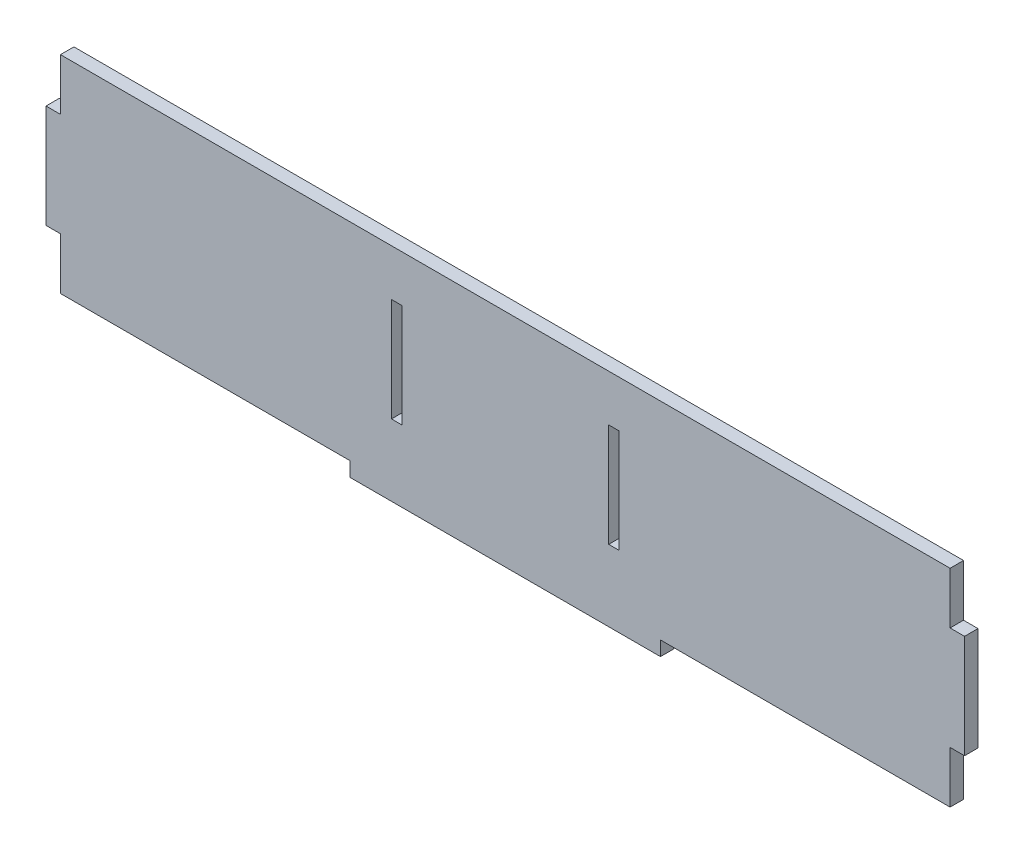
ISO-10303-21;
HEADER;
FILE_DESCRIPTION(('STEP AP214'),'2;1');
FILE_NAME('part.step','',(''),(''),'','','');
FILE_SCHEMA(('AUTOMOTIVE_DESIGN { 1 0 10303 214 1 1 1 1 }'));
ENDSEC;
DATA;
#1=APPLICATION_CONTEXT('core data for automotive mechanical design processes');
#2=APPLICATION_PROTOCOL_DEFINITION('international standard','automotive_design',2000,#1);
#3=PRODUCT_CONTEXT('',#1,'mechanical');
#4=PRODUCT('Part','Part','',(#3));
#5=PRODUCT_RELATED_PRODUCT_CATEGORY('part','',(#4));
#6=PRODUCT_DEFINITION_FORMATION('','',#4);
#7=PRODUCT_DEFINITION_CONTEXT('part definition',#1,'design');
#8=PRODUCT_DEFINITION('design','',#6,#7);
#9=PRODUCT_DEFINITION_SHAPE('','',#8);
#10=(LENGTH_UNIT() NAMED_UNIT(*) SI_UNIT(.MILLI.,.METRE.));
#11=(NAMED_UNIT(*) PLANE_ANGLE_UNIT() SI_UNIT($,.RADIAN.));
#12=(NAMED_UNIT(*) SI_UNIT($,.STERADIAN.) SOLID_ANGLE_UNIT());
#13=UNCERTAINTY_MEASURE_WITH_UNIT(LENGTH_MEASURE(1.E-05),#10,'distance_accuracy_value','');
#14=(GEOMETRIC_REPRESENTATION_CONTEXT(3) GLOBAL_UNCERTAINTY_ASSIGNED_CONTEXT((#13)) GLOBAL_UNIT_ASSIGNED_CONTEXT((#10,
#11,#12)) REPRESENTATION_CONTEXT('',''));
#15=CARTESIAN_POINT('',(0.,0.,0.));
#16=DIRECTION('',(0.,0.,1.));
#17=DIRECTION('',(1.,0.,0.));
#18=AXIS2_PLACEMENT_3D('',#15,#16,#17);
#19=CARTESIAN_POINT('',(43.,10.,1.3));
#20=DIRECTION('',(-1.,0.,0.));
#21=DIRECTION('',(0.,0.,1.));
#22=AXIS2_PLACEMENT_3D('',#19,#20,#21);
#23=PLANE('',#22);
#24=DIRECTION('',(0.,0.,1.));
#25=VECTOR('',#24,1.);
#26=CARTESIAN_POINT('',(43.,5.,0.));
#27=LINE('',#26,#25);
#28=CARTESIAN_POINT('',(43.,5.,0.));
#29=VERTEX_POINT('',#28);
#30=CARTESIAN_POINT('',(43.,5.,1.3));
#31=VERTEX_POINT('',#30);
#32=EDGE_CURVE('E251',#29,#31,#27,.T.);
#33=ORIENTED_EDGE('',*,*,#32,.F.);
#34=DIRECTION('',(0.,1.,0.));
#35=VECTOR('',#34,1.);
#36=CARTESIAN_POINT('',(43.,10.,0.));
#37=LINE('',#36,#35);
#38=CARTESIAN_POINT('',(43.,10.,0.));
#39=VERTEX_POINT('',#38);
#40=EDGE_CURVE('E398',#29,#39,#37,.T.);
#41=ORIENTED_EDGE('',*,*,#40,.T.);
#42=DIRECTION('',(0.,0.,-1.));
#43=VECTOR('',#42,1.);
#44=CARTESIAN_POINT('',(43.,10.,1.3));
#45=LINE('',#44,#43);
#46=CARTESIAN_POINT('',(43.,10.,1.3));
#47=VERTEX_POINT('',#46);
#48=EDGE_CURVE('E11',#47,#39,#45,.T.);
#49=ORIENTED_EDGE('',*,*,#48,.F.);
#50=DIRECTION('',(0.,1.,0.));
#51=VECTOR('',#50,1.);
#52=CARTESIAN_POINT('',(43.,10.,1.3));
#53=LINE('',#52,#51);
#54=EDGE_CURVE('E412',#31,#47,#53,.T.);
#55=ORIENTED_EDGE('',*,*,#54,.F.);
#56=EDGE_LOOP('',(#33,#41,#49,#55));
#57=FACE_BOUND('',#56,.T.);
#58=ADVANCED_FACE('F43',(#57),#23,.F.);
#59=CARTESIAN_POINT('',(-43.,10.,1.3));
#60=DIRECTION('',(1.,0.,0.));
#61=DIRECTION('',(0.,1.,0.));
#62=AXIS2_PLACEMENT_3D('',#59,#60,#61);
#63=PLANE('',#62);
#64=DIRECTION('',(0.,0.,1.));
#65=VECTOR('',#64,1.);
#66=CARTESIAN_POINT('',(-43.,-5.,0.));
#67=LINE('',#66,#65);
#68=CARTESIAN_POINT('',(-43.,-5.,0.));
#69=VERTEX_POINT('',#68);
#70=CARTESIAN_POINT('',(-43.,-5.,1.3));
#71=VERTEX_POINT('',#70);
#72=EDGE_CURVE('E325',#69,#71,#67,.T.);
#73=ORIENTED_EDGE('',*,*,#72,.F.);
#74=DIRECTION('',(0.,-1.,0.));
#75=VECTOR('',#74,1.);
#76=CARTESIAN_POINT('',(-43.,10.,0.));
#77=LINE('',#76,#75);
#78=CARTESIAN_POINT('',(-43.,-10.,0.));
#79=VERTEX_POINT('',#78);
#80=EDGE_CURVE('E433',#69,#79,#77,.T.);
#81=ORIENTED_EDGE('',*,*,#80,.T.);
#82=DIRECTION('',(0.,0.,-1.));
#83=VECTOR('',#82,1.);
#84=CARTESIAN_POINT('',(-43.,-10.,1.3));
#85=LINE('',#84,#83);
#86=CARTESIAN_POINT('',(-43.,-10.,1.3));
#87=VERTEX_POINT('',#86);
#88=EDGE_CURVE('E446',#87,#79,#85,.T.);
#89=ORIENTED_EDGE('',*,*,#88,.F.);
#90=DIRECTION('',(0.,-1.,0.));
#91=VECTOR('',#90,1.);
#92=CARTESIAN_POINT('',(-43.,10.,1.3));
#93=LINE('',#92,#91);
#94=EDGE_CURVE('E415',#71,#87,#93,.T.);
#95=ORIENTED_EDGE('',*,*,#94,.F.);
#96=EDGE_LOOP('',(#73,#81,#89,#95));
#97=FACE_BOUND('',#96,.T.);
#98=ADVANCED_FACE('F511',(#97),#63,.F.);
#99=CARTESIAN_POINT('',(-43.,-10.,1.3));
#100=DIRECTION('',(0.,1.,0.));
#101=DIRECTION('',(0.,0.,1.));
#102=AXIS2_PLACEMENT_3D('',#99,#100,#101);
#103=PLANE('',#102);
#104=DIRECTION('',(0.,0.,1.));
#105=VECTOR('',#104,1.);
#106=CARTESIAN_POINT('',(15.,-10.,0.));
#107=LINE('',#106,#105);
#108=CARTESIAN_POINT('',(15.,-10.,0.));
#109=VERTEX_POINT('',#108);
#110=CARTESIAN_POINT('',(15.,-10.,1.3));
#111=VERTEX_POINT('',#110);
#112=EDGE_CURVE('E399',#109,#111,#107,.T.);
#113=ORIENTED_EDGE('',*,*,#112,.F.);
#114=DIRECTION('',(1.,0.,0.));
#115=VECTOR('',#114,1.);
#116=CARTESIAN_POINT('',(-43.,-10.,0.));
#117=LINE('',#116,#115);
#118=CARTESIAN_POINT('',(43.,-10.,0.));
#119=VERTEX_POINT('',#118);
#120=EDGE_CURVE('E438',#109,#119,#117,.T.);
#121=ORIENTED_EDGE('',*,*,#120,.T.);
#122=DIRECTION('',(0.,0.,-1.));
#123=VECTOR('',#122,1.);
#124=CARTESIAN_POINT('',(43.,-10.,1.3));
#125=LINE('',#124,#123);
#126=CARTESIAN_POINT('',(43.,-10.,1.3));
#127=VERTEX_POINT('',#126);
#128=EDGE_CURVE('E425',#127,#119,#125,.T.);
#129=ORIENTED_EDGE('',*,*,#128,.F.);
#130=DIRECTION('',(1.,0.,0.));
#131=VECTOR('',#130,1.);
#132=CARTESIAN_POINT('',(-43.,-10.,1.3));
#133=LINE('',#132,#131);
#134=EDGE_CURVE('E420',#111,#127,#133,.T.);
#135=ORIENTED_EDGE('',*,*,#134,.F.);
#136=EDGE_LOOP('',(#113,#121,#129,#135));
#137=FACE_BOUND('',#136,.T.);
#138=ADVANCED_FACE('F488',(#137),#103,.F.);
#139=CARTESIAN_POINT('',(43.,-5.,0.));
#140=VERTEX_POINT('',#139);
#141=EDGE_CURVE('E426',#119,#140,#37,.T.);
#142=ORIENTED_EDGE('',*,*,#141,.T.);
#143=DIRECTION('',(0.,0.,1.));
#144=VECTOR('',#143,1.);
#145=CARTESIAN_POINT('',(43.,-5.,0.));
#146=LINE('',#145,#144);
#147=CARTESIAN_POINT('',(43.,-5.,1.3));
#148=VERTEX_POINT('',#147);
#149=EDGE_CURVE('E299',#140,#148,#146,.T.);
#150=ORIENTED_EDGE('',*,*,#149,.T.);
#151=EDGE_CURVE('E407',#127,#148,#53,.T.);
#152=ORIENTED_EDGE('',*,*,#151,.F.);
#153=ORIENTED_EDGE('',*,*,#128,.T.);
#154=EDGE_LOOP('',(#142,#150,#152,#153));
#155=FACE_BOUND('',#154,.T.);
#156=ADVANCED_FACE('F45',(#155),#23,.F.);
#157=CARTESIAN_POINT('',(-43.,10.,1.3));
#158=DIRECTION('',(0.,-1.,0.));
#159=DIRECTION('',(0.,0.,-1.));
#160=AXIS2_PLACEMENT_3D('',#157,#158,#159);
#161=PLANE('',#160);
#162=DIRECTION('',(-1.,0.,0.));
#163=VECTOR('',#162,1.);
#164=CARTESIAN_POINT('',(-43.,10.,0.));
#165=LINE('',#164,#163);
#166=CARTESIAN_POINT('',(-43.,10.,0.));
#167=VERTEX_POINT('',#166);
#168=EDGE_CURVE('E430',#39,#167,#165,.T.);
#169=ORIENTED_EDGE('',*,*,#168,.T.);
#170=DIRECTION('',(0.,0.,-1.));
#171=VECTOR('',#170,1.);
#172=CARTESIAN_POINT('',(-43.,10.,1.3));
#173=LINE('',#172,#171);
#174=CARTESIAN_POINT('',(-43.,10.,1.3));
#175=VERTEX_POINT('',#174);
#176=EDGE_CURVE('E52',#175,#167,#173,.T.);
#177=ORIENTED_EDGE('',*,*,#176,.F.);
#178=DIRECTION('',(-1.,0.,0.));
#179=VECTOR('',#178,1.);
#180=CARTESIAN_POINT('',(-43.,10.,1.3));
#181=LINE('',#180,#179);
#182=EDGE_CURVE('E411',#47,#175,#181,.T.);
#183=ORIENTED_EDGE('',*,*,#182,.F.);
#184=ORIENTED_EDGE('',*,*,#48,.T.);
#185=EDGE_LOOP('',(#169,#177,#183,#184));
#186=FACE_BOUND('',#185,.T.);
#187=ADVANCED_FACE('F472',(#186),#161,.F.);
#188=CARTESIAN_POINT('',(-43.,5.,0.));
#189=VERTEX_POINT('',#188);
#190=EDGE_CURVE('E434',#167,#189,#77,.T.);
#191=ORIENTED_EDGE('',*,*,#190,.T.);
#192=DIRECTION('',(0.,0.,1.));
#193=VECTOR('',#192,1.);
#194=CARTESIAN_POINT('',(-43.,5.,0.));
#195=LINE('',#194,#193);
#196=CARTESIAN_POINT('',(-43.,5.,1.3));
#197=VERTEX_POINT('',#196);
#198=EDGE_CURVE('E335',#189,#197,#195,.T.);
#199=ORIENTED_EDGE('',*,*,#198,.T.);
#200=EDGE_CURVE('E416',#175,#197,#93,.T.);
#201=ORIENTED_EDGE('',*,*,#200,.F.);
#202=ORIENTED_EDGE('',*,*,#176,.T.);
#203=EDGE_LOOP('',(#191,#199,#201,#202));
#204=FACE_BOUND('',#203,.T.);
#205=ADVANCED_FACE('F455',(#204),#63,.F.);
#206=CARTESIAN_POINT('',(-15.,-10.,0.));
#207=VERTEX_POINT('',#206);
#208=EDGE_CURVE('E439',#79,#207,#117,.T.);
#209=ORIENTED_EDGE('',*,*,#208,.T.);
#210=DIRECTION('',(0.,0.,1.));
#211=VECTOR('',#210,1.);
#212=CARTESIAN_POINT('',(-15.,-10.,0.));
#213=LINE('',#212,#211);
#214=CARTESIAN_POINT('',(-15.,-10.,1.3));
#215=VERTEX_POINT('',#214);
#216=EDGE_CURVE('E394',#207,#215,#213,.T.);
#217=ORIENTED_EDGE('',*,*,#216,.T.);
#218=EDGE_CURVE('E421',#87,#215,#133,.T.);
#219=ORIENTED_EDGE('',*,*,#218,.F.);
#220=ORIENTED_EDGE('',*,*,#88,.T.);
#221=EDGE_LOOP('',(#209,#217,#219,#220));
#222=FACE_BOUND('',#221,.T.);
#223=ADVANCED_FACE('F523',(#222),#103,.F.);
#224=CARTESIAN_POINT('',(0.,0.,1.3));
#225=DIRECTION('',(0.,0.,1.));
#226=DIRECTION('',(1.,0.,0.));
#227=AXIS2_PLACEMENT_3D('',#224,#225,#226);
#228=PLANE('',#227);
#229=DIRECTION('',(0.,-1.,0.));
#230=VECTOR('',#229,1.);
#231=CARTESIAN_POINT('',(-11.,5.5,1.3));
#232=LINE('',#231,#230);
#233=CARTESIAN_POINT('',(-11.,5.5,1.3));
#234=VERTEX_POINT('',#233);
#235=CARTESIAN_POINT('',(-11.,-4.5,1.3));
#236=VERTEX_POINT('',#235);
#237=EDGE_CURVE('E59',#234,#236,#232,.T.);
#238=ORIENTED_EDGE('',*,*,#237,.F.);
#239=DIRECTION('',(-1.,0.,0.));
#240=VECTOR('',#239,1.);
#241=CARTESIAN_POINT('',(-11.,5.5,1.3));
#242=LINE('',#241,#240);
#243=CARTESIAN_POINT('',(-10.,5.5,1.3));
#244=VERTEX_POINT('',#243);
#245=EDGE_CURVE('E229',#244,#234,#242,.T.);
#246=ORIENTED_EDGE('',*,*,#245,.F.);
#247=DIRECTION('',(0.,1.,0.));
#248=VECTOR('',#247,1.);
#249=CARTESIAN_POINT('',(-10.,5.5,1.3));
#250=LINE('',#249,#248);
#251=CARTESIAN_POINT('',(-10.,-4.5,1.3));
#252=VERTEX_POINT('',#251);
#253=EDGE_CURVE('E233',#252,#244,#250,.T.);
#254=ORIENTED_EDGE('',*,*,#253,.F.);
#255=DIRECTION('',(1.,0.,0.));
#256=VECTOR('',#255,1.);
#257=CARTESIAN_POINT('',(-11.,-4.5,1.3));
#258=LINE('',#257,#256);
#259=EDGE_CURVE('E242',#236,#252,#258,.T.);
#260=ORIENTED_EDGE('',*,*,#259,.F.);
#261=EDGE_LOOP('',(#238,#246,#254,#260));
#262=FACE_BOUND('',#261,.T.);
#263=DIRECTION('',(0.,-1.,0.));
#264=VECTOR('',#263,1.);
#265=CARTESIAN_POINT('',(10.,5.5,1.3));
#266=LINE('',#265,#264);
#267=CARTESIAN_POINT('',(10.,5.5,1.3));
#268=VERTEX_POINT('',#267);
#269=CARTESIAN_POINT('',(10.,-4.5,1.3));
#270=VERTEX_POINT('',#269);
#271=EDGE_CURVE('E67',#268,#270,#266,.T.);
#272=ORIENTED_EDGE('',*,*,#271,.F.);
#273=DIRECTION('',(-1.,0.,0.));
#274=VECTOR('',#273,1.);
#275=CARTESIAN_POINT('',(10.,5.5,1.3));
#276=LINE('',#275,#274);
#277=CARTESIAN_POINT('',(11.,5.5,1.3));
#278=VERTEX_POINT('',#277);
#279=EDGE_CURVE('E270',#278,#268,#276,.T.);
#280=ORIENTED_EDGE('',*,*,#279,.F.);
#281=DIRECTION('',(0.,1.,0.));
#282=VECTOR('',#281,1.);
#283=CARTESIAN_POINT('',(11.,5.5,1.3));
#284=LINE('',#283,#282);
#285=CARTESIAN_POINT('',(11.,-4.5,1.3));
#286=VERTEX_POINT('',#285);
#287=EDGE_CURVE('E274',#286,#278,#284,.T.);
#288=ORIENTED_EDGE('',*,*,#287,.F.);
#289=DIRECTION('',(1.,0.,0.));
#290=VECTOR('',#289,1.);
#291=CARTESIAN_POINT('',(10.,-4.5,1.3));
#292=LINE('',#291,#290);
#293=EDGE_CURVE('E279',#270,#286,#292,.T.);
#294=ORIENTED_EDGE('',*,*,#293,.F.);
#295=EDGE_LOOP('',(#272,#280,#288,#294));
#296=FACE_BOUND('',#295,.T.);
#297=ORIENTED_EDGE('',*,*,#151,.T.);
#298=DIRECTION('',(1.,0.,0.));
#299=VECTOR('',#298,1.);
#300=CARTESIAN_POINT('',(43.,-5.,1.3));
#301=LINE('',#300,#299);
#302=CARTESIAN_POINT('',(44.4,-5.,1.3));
#303=VERTEX_POINT('',#302);
#304=EDGE_CURVE('E321',#148,#303,#301,.T.);
#305=ORIENTED_EDGE('',*,*,#304,.T.);
#306=DIRECTION('',(0.,1.,0.));
#307=VECTOR('',#306,1.);
#308=CARTESIAN_POINT('',(44.4,5.,1.3));
#309=LINE('',#308,#307);
#310=CARTESIAN_POINT('',(44.4,5.,1.3));
#311=VERTEX_POINT('',#310);
#312=EDGE_CURVE('E316',#303,#311,#309,.T.);
#313=ORIENTED_EDGE('',*,*,#312,.T.);
#314=DIRECTION('',(-1.,0.,0.));
#315=VECTOR('',#314,1.);
#316=CARTESIAN_POINT('',(43.,5.,1.3));
#317=LINE('',#316,#315);
#318=EDGE_CURVE('E312',#311,#31,#317,.T.);
#319=ORIENTED_EDGE('',*,*,#318,.T.);
#320=ORIENTED_EDGE('',*,*,#54,.T.);
#321=ORIENTED_EDGE('',*,*,#182,.T.);
#322=ORIENTED_EDGE('',*,*,#200,.T.);
#323=DIRECTION('',(-1.,0.,0.));
#324=VECTOR('',#323,1.);
#325=CARTESIAN_POINT('',(-43.,5.,1.3));
#326=LINE('',#325,#324);
#327=CARTESIAN_POINT('',(-44.4,5.,1.3));
#328=VERTEX_POINT('',#327);
#329=EDGE_CURVE('E357',#197,#328,#326,.T.);
#330=ORIENTED_EDGE('',*,*,#329,.T.);
#331=DIRECTION('',(0.,-1.,0.));
#332=VECTOR('',#331,1.);
#333=CARTESIAN_POINT('',(-44.4,5.,1.3));
#334=LINE('',#333,#332);
#335=CARTESIAN_POINT('',(-44.4,-5.,1.3));
#336=VERTEX_POINT('',#335);
#337=EDGE_CURVE('E352',#328,#336,#334,.T.);
#338=ORIENTED_EDGE('',*,*,#337,.T.);
#339=DIRECTION('',(1.,0.,0.));
#340=VECTOR('',#339,1.);
#341=CARTESIAN_POINT('',(-43.,-5.,1.3));
#342=LINE('',#341,#340);
#343=EDGE_CURVE('E348',#336,#71,#342,.T.);
#344=ORIENTED_EDGE('',*,*,#343,.T.);
#345=ORIENTED_EDGE('',*,*,#94,.T.);
#346=ORIENTED_EDGE('',*,*,#218,.T.);
#347=DIRECTION('',(0.,-1.,0.));
#348=VECTOR('',#347,1.);
#349=CARTESIAN_POINT('',(-15.,-10.,1.3));
#350=LINE('',#349,#348);
#351=CARTESIAN_POINT('',(-15.,-11.4,1.3));
#352=VERTEX_POINT('',#351);
#353=EDGE_CURVE('E361',#215,#352,#350,.T.);
#354=ORIENTED_EDGE('',*,*,#353,.T.);
#355=DIRECTION('',(1.,0.,0.));
#356=VECTOR('',#355,1.);
#357=CARTESIAN_POINT('',(-15.,-11.4,1.3));
#358=LINE('',#357,#356);
#359=CARTESIAN_POINT('',(15.,-11.4,1.3));
#360=VERTEX_POINT('',#359);
#361=EDGE_CURVE('E387',#352,#360,#358,.T.);
#362=ORIENTED_EDGE('',*,*,#361,.T.);
#363=DIRECTION('',(0.,1.,0.));
#364=VECTOR('',#363,1.);
#365=CARTESIAN_POINT('',(15.,-10.,1.3));
#366=LINE('',#365,#364);
#367=EDGE_CURVE('E376',#360,#111,#366,.T.);
#368=ORIENTED_EDGE('',*,*,#367,.T.);
#369=ORIENTED_EDGE('',*,*,#134,.T.);
#370=EDGE_LOOP('',(#297,#305,#313,#319,#320,#321,#322,#330,#338,#344,#345,#346,#354,#362,#368,#369));
#371=FACE_BOUND('',#370,.T.);
#372=ADVANCED_FACE('F469',(#262,#296,#371),#228,.T.);
#373=CARTESIAN_POINT('',(0.,0.,0.));
#374=DIRECTION('',(0.,0.,1.));
#375=DIRECTION('',(1.,0.,0.));
#376=AXIS2_PLACEMENT_3D('',#373,#374,#375);
#377=PLANE('',#376);
#378=DIRECTION('',(-1.,0.,0.));
#379=VECTOR('',#378,1.);
#380=CARTESIAN_POINT('',(-11.,5.5,0.));
#381=LINE('',#380,#379);
#382=CARTESIAN_POINT('',(-10.,5.5,0.));
#383=VERTEX_POINT('',#382);
#384=CARTESIAN_POINT('',(-11.,5.5,0.));
#385=VERTEX_POINT('',#384);
#386=EDGE_CURVE('E214',#383,#385,#381,.T.);
#387=ORIENTED_EDGE('',*,*,#386,.T.);
#388=DIRECTION('',(0.,-1.,0.));
#389=VECTOR('',#388,1.);
#390=CARTESIAN_POINT('',(-11.,5.5,0.));
#391=LINE('',#390,#389);
#392=CARTESIAN_POINT('',(-11.,-4.5,0.));
#393=VERTEX_POINT('',#392);
#394=EDGE_CURVE('E207',#385,#393,#391,.T.);
#395=ORIENTED_EDGE('',*,*,#394,.T.);
#396=DIRECTION('',(1.,0.,0.));
#397=VECTOR('',#396,1.);
#398=CARTESIAN_POINT('',(-11.,-4.5,0.));
#399=LINE('',#398,#397);
#400=CARTESIAN_POINT('',(-10.,-4.5,0.));
#401=VERTEX_POINT('',#400);
#402=EDGE_CURVE('E218',#393,#401,#399,.T.);
#403=ORIENTED_EDGE('',*,*,#402,.T.);
#404=DIRECTION('',(0.,1.,0.));
#405=VECTOR('',#404,1.);
#406=CARTESIAN_POINT('',(-10.,5.5,0.));
#407=LINE('',#406,#405);
#408=EDGE_CURVE('E223',#401,#383,#407,.T.);
#409=ORIENTED_EDGE('',*,*,#408,.T.);
#410=EDGE_LOOP('',(#387,#395,#403,#409));
#411=FACE_BOUND('',#410,.T.);
#412=DIRECTION('',(-1.,0.,0.));
#413=VECTOR('',#412,1.);
#414=CARTESIAN_POINT('',(10.,5.5,0.));
#415=LINE('',#414,#413);
#416=CARTESIAN_POINT('',(11.,5.5,0.));
#417=VERTEX_POINT('',#416);
#418=CARTESIAN_POINT('',(10.,5.5,0.));
#419=VERTEX_POINT('',#418);
#420=EDGE_CURVE('E260',#417,#419,#415,.T.);
#421=ORIENTED_EDGE('',*,*,#420,.T.);
#422=DIRECTION('',(0.,-1.,0.));
#423=VECTOR('',#422,1.);
#424=CARTESIAN_POINT('',(10.,5.5,0.));
#425=LINE('',#424,#423);
#426=CARTESIAN_POINT('',(10.,-4.5,0.));
#427=VERTEX_POINT('',#426);
#428=EDGE_CURVE('E275',#419,#427,#425,.T.);
#429=ORIENTED_EDGE('',*,*,#428,.T.);
#430=DIRECTION('',(1.,0.,0.));
#431=VECTOR('',#430,1.);
#432=CARTESIAN_POINT('',(10.,-4.5,0.));
#433=LINE('',#432,#431);
#434=CARTESIAN_POINT('',(11.,-4.5,0.));
#435=VERTEX_POINT('',#434);
#436=EDGE_CURVE('E292',#427,#435,#433,.T.);
#437=ORIENTED_EDGE('',*,*,#436,.T.);
#438=DIRECTION('',(0.,1.,0.));
#439=VECTOR('',#438,1.);
#440=CARTESIAN_POINT('',(11.,5.5,0.));
#441=LINE('',#440,#439);
#442=EDGE_CURVE('E288',#435,#417,#441,.T.);
#443=ORIENTED_EDGE('',*,*,#442,.T.);
#444=EDGE_LOOP('',(#421,#429,#437,#443));
#445=FACE_BOUND('',#444,.T.);
#446=ORIENTED_EDGE('',*,*,#141,.F.);
#447=ORIENTED_EDGE('',*,*,#120,.F.);
#448=DIRECTION('',(0.,1.,0.));
#449=VECTOR('',#448,1.);
#450=CARTESIAN_POINT('',(15.,-10.,0.));
#451=LINE('',#450,#449);
#452=CARTESIAN_POINT('',(15.,-11.4,0.));
#453=VERTEX_POINT('',#452);
#454=EDGE_CURVE('E380',#453,#109,#451,.T.);
#455=ORIENTED_EDGE('',*,*,#454,.F.);
#456=DIRECTION('',(1.,0.,0.));
#457=VECTOR('',#456,1.);
#458=CARTESIAN_POINT('',(-15.,-11.4,0.));
#459=LINE('',#458,#457);
#460=CARTESIAN_POINT('',(-15.,-11.4,0.));
#461=VERTEX_POINT('',#460);
#462=EDGE_CURVE('E375',#461,#453,#459,.T.);
#463=ORIENTED_EDGE('',*,*,#462,.F.);
#464=DIRECTION('',(0.,-1.,0.));
#465=VECTOR('',#464,1.);
#466=CARTESIAN_POINT('',(-15.,-10.,0.));
#467=LINE('',#466,#465);
#468=EDGE_CURVE('E371',#207,#461,#467,.T.);
#469=ORIENTED_EDGE('',*,*,#468,.F.);
#470=ORIENTED_EDGE('',*,*,#208,.F.);
#471=ORIENTED_EDGE('',*,*,#80,.F.);
#472=DIRECTION('',(1.,0.,0.));
#473=VECTOR('',#472,1.);
#474=CARTESIAN_POINT('',(-43.,-5.,0.));
#475=LINE('',#474,#473);
#476=CARTESIAN_POINT('',(-44.4,-5.,0.));
#477=VERTEX_POINT('',#476);
#478=EDGE_CURVE('E339',#477,#69,#475,.T.);
#479=ORIENTED_EDGE('',*,*,#478,.F.);
#480=DIRECTION('',(0.,-1.,0.));
#481=VECTOR('',#480,1.);
#482=CARTESIAN_POINT('',(-44.4,5.,0.));
#483=LINE('',#482,#481);
#484=CARTESIAN_POINT('',(-44.4,5.,0.));
#485=VERTEX_POINT('',#484);
#486=EDGE_CURVE('E364',#485,#477,#483,.T.);
#487=ORIENTED_EDGE('',*,*,#486,.F.);
#488=DIRECTION('',(-1.,0.,0.));
#489=VECTOR('',#488,1.);
#490=CARTESIAN_POINT('',(-43.,5.,0.));
#491=LINE('',#490,#489);
#492=EDGE_CURVE('E353',#189,#485,#491,.T.);
#493=ORIENTED_EDGE('',*,*,#492,.F.);
#494=ORIENTED_EDGE('',*,*,#190,.F.);
#495=ORIENTED_EDGE('',*,*,#168,.F.);
#496=ORIENTED_EDGE('',*,*,#40,.F.);
#497=DIRECTION('',(-1.,0.,0.));
#498=VECTOR('',#497,1.);
#499=CARTESIAN_POINT('',(43.,5.,0.));
#500=LINE('',#499,#498);
#501=CARTESIAN_POINT('',(44.4,5.,0.));
#502=VERTEX_POINT('',#501);
#503=EDGE_CURVE('E303',#502,#29,#500,.T.);
#504=ORIENTED_EDGE('',*,*,#503,.F.);
#505=DIRECTION('',(0.,1.,0.));
#506=VECTOR('',#505,1.);
#507=CARTESIAN_POINT('',(44.4,5.,0.));
#508=LINE('',#507,#506);
#509=CARTESIAN_POINT('',(44.4,-5.,0.));
#510=VERTEX_POINT('',#509);
#511=EDGE_CURVE('E328',#510,#502,#508,.T.);
#512=ORIENTED_EDGE('',*,*,#511,.F.);
#513=DIRECTION('',(1.,0.,0.));
#514=VECTOR('',#513,1.);
#515=CARTESIAN_POINT('',(43.,-5.,0.));
#516=LINE('',#515,#514);
#517=EDGE_CURVE('E317',#140,#510,#516,.T.);
#518=ORIENTED_EDGE('',*,*,#517,.F.);
#519=EDGE_LOOP('',(#446,#447,#455,#463,#469,#470,#471,#479,#487,#493,#494,#495,#496,#504,#512,#518));
#520=FACE_BOUND('',#519,.T.);
#521=ADVANCED_FACE('F225',(#411,#445,#520),#377,.F.);
#522=CARTESIAN_POINT('',(-15.,-10.,0.));
#523=DIRECTION('',(-1.,0.,0.));
#524=DIRECTION('',(0.,-1.,0.));
#525=AXIS2_PLACEMENT_3D('',#522,#523,#524);
#526=PLANE('',#525);
#527=ORIENTED_EDGE('',*,*,#353,.F.);
#528=ORIENTED_EDGE('',*,*,#216,.F.);
#529=ORIENTED_EDGE('',*,*,#468,.T.);
#530=DIRECTION('',(0.,0.,1.));
#531=VECTOR('',#530,1.);
#532=CARTESIAN_POINT('',(-15.,-11.4,0.));
#533=LINE('',#532,#531);
#534=EDGE_CURVE('E383',#461,#352,#533,.T.);
#535=ORIENTED_EDGE('',*,*,#534,.T.);
#536=EDGE_LOOP('',(#527,#528,#529,#535));
#537=FACE_BOUND('',#536,.T.);
#538=ADVANCED_FACE('F543',(#537),#526,.T.);
#539=CARTESIAN_POINT('',(15.,-10.,0.));
#540=DIRECTION('',(1.,0.,0.));
#541=DIRECTION('',(0.,1.,0.));
#542=AXIS2_PLACEMENT_3D('',#539,#540,#541);
#543=PLANE('',#542);
#544=ORIENTED_EDGE('',*,*,#367,.F.);
#545=DIRECTION('',(0.,0.,1.));
#546=VECTOR('',#545,1.);
#547=CARTESIAN_POINT('',(15.,-11.4,0.));
#548=LINE('',#547,#546);
#549=EDGE_CURVE('E402',#453,#360,#548,.T.);
#550=ORIENTED_EDGE('',*,*,#549,.F.);
#551=ORIENTED_EDGE('',*,*,#454,.T.);
#552=ORIENTED_EDGE('',*,*,#112,.T.);
#553=EDGE_LOOP('',(#544,#550,#551,#552));
#554=FACE_BOUND('',#553,.T.);
#555=ADVANCED_FACE('F559',(#554),#543,.T.);
#556=CARTESIAN_POINT('',(-15.,-11.4,0.));
#557=DIRECTION('',(0.,-1.,0.));
#558=DIRECTION('',(0.,0.,-1.));
#559=AXIS2_PLACEMENT_3D('',#556,#557,#558);
#560=PLANE('',#559);
#561=ORIENTED_EDGE('',*,*,#361,.F.);
#562=ORIENTED_EDGE('',*,*,#534,.F.);
#563=ORIENTED_EDGE('',*,*,#462,.T.);
#564=ORIENTED_EDGE('',*,*,#549,.T.);
#565=EDGE_LOOP('',(#561,#562,#563,#564));
#566=FACE_BOUND('',#565,.T.);
#567=ADVANCED_FACE('F556',(#566),#560,.T.);
#568=CARTESIAN_POINT('',(-43.,-5.,0.));
#569=DIRECTION('',(0.,-1.,0.));
#570=DIRECTION('',(1.,0.,0.));
#571=AXIS2_PLACEMENT_3D('',#568,#569,#570);
#572=PLANE('',#571);
#573=ORIENTED_EDGE('',*,*,#343,.F.);
#574=DIRECTION('',(0.,0.,1.));
#575=VECTOR('',#574,1.);
#576=CARTESIAN_POINT('',(-44.4,-5.,0.));
#577=LINE('',#576,#575);
#578=EDGE_CURVE('E343',#477,#336,#577,.T.);
#579=ORIENTED_EDGE('',*,*,#578,.F.);
#580=ORIENTED_EDGE('',*,*,#478,.T.);
#581=ORIENTED_EDGE('',*,*,#72,.T.);
#582=EDGE_LOOP('',(#573,#579,#580,#581));
#583=FACE_BOUND('',#582,.T.);
#584=ADVANCED_FACE('F549',(#583),#572,.T.);
#585=CARTESIAN_POINT('',(-44.4,5.,0.));
#586=DIRECTION('',(-1.,0.,0.));
#587=DIRECTION('',(0.,-1.,0.));
#588=AXIS2_PLACEMENT_3D('',#585,#586,#587);
#589=PLANE('',#588);
#590=ORIENTED_EDGE('',*,*,#337,.F.);
#591=DIRECTION('',(0.,0.,1.));
#592=VECTOR('',#591,1.);
#593=CARTESIAN_POINT('',(-44.4,5.,0.));
#594=LINE('',#593,#592);
#595=EDGE_CURVE('E340',#485,#328,#594,.T.);
#596=ORIENTED_EDGE('',*,*,#595,.F.);
#597=ORIENTED_EDGE('',*,*,#486,.T.);
#598=ORIENTED_EDGE('',*,*,#578,.T.);
#599=EDGE_LOOP('',(#590,#596,#597,#598));
#600=FACE_BOUND('',#599,.T.);
#601=ADVANCED_FACE('F508',(#600),#589,.T.);
#602=CARTESIAN_POINT('',(-43.,5.,0.));
#603=DIRECTION('',(0.,1.,0.));
#604=DIRECTION('',(-1.,0.,0.));
#605=AXIS2_PLACEMENT_3D('',#602,#603,#604);
#606=PLANE('',#605);
#607=ORIENTED_EDGE('',*,*,#329,.F.);
#608=ORIENTED_EDGE('',*,*,#198,.F.);
#609=ORIENTED_EDGE('',*,*,#492,.T.);
#610=ORIENTED_EDGE('',*,*,#595,.T.);
#611=EDGE_LOOP('',(#607,#608,#609,#610));
#612=FACE_BOUND('',#611,.T.);
#613=ADVANCED_FACE('F466',(#612),#606,.T.);
#614=CARTESIAN_POINT('',(43.,5.,0.));
#615=DIRECTION('',(0.,1.,0.));
#616=DIRECTION('',(0.,0.,1.));
#617=AXIS2_PLACEMENT_3D('',#614,#615,#616);
#618=PLANE('',#617);
#619=ORIENTED_EDGE('',*,*,#318,.F.);
#620=DIRECTION('',(0.,0.,1.));
#621=VECTOR('',#620,1.);
#622=CARTESIAN_POINT('',(44.4,5.,0.));
#623=LINE('',#622,#621);
#624=EDGE_CURVE('E307',#502,#311,#623,.T.);
#625=ORIENTED_EDGE('',*,*,#624,.F.);
#626=ORIENTED_EDGE('',*,*,#503,.T.);
#627=ORIENTED_EDGE('',*,*,#32,.T.);
#628=EDGE_LOOP('',(#619,#625,#626,#627));
#629=FACE_BOUND('',#628,.T.);
#630=ADVANCED_FACE('F500',(#629),#618,.T.);
#631=CARTESIAN_POINT('',(44.4,5.,0.));
#632=DIRECTION('',(1.,0.,0.));
#633=DIRECTION('',(0.,0.,-1.));
#634=AXIS2_PLACEMENT_3D('',#631,#632,#633);
#635=PLANE('',#634);
#636=ORIENTED_EDGE('',*,*,#312,.F.);
#637=DIRECTION('',(0.,0.,1.));
#638=VECTOR('',#637,1.);
#639=CARTESIAN_POINT('',(44.4,-5.,0.));
#640=LINE('',#639,#638);
#641=EDGE_CURVE('E304',#510,#303,#640,.T.);
#642=ORIENTED_EDGE('',*,*,#641,.F.);
#643=ORIENTED_EDGE('',*,*,#511,.T.);
#644=ORIENTED_EDGE('',*,*,#624,.T.);
#645=EDGE_LOOP('',(#636,#642,#643,#644));
#646=FACE_BOUND('',#645,.T.);
#647=ADVANCED_FACE('F497',(#646),#635,.T.);
#648=CARTESIAN_POINT('',(43.,-5.,0.));
#649=DIRECTION('',(0.,-1.,0.));
#650=DIRECTION('',(1.,0.,0.));
#651=AXIS2_PLACEMENT_3D('',#648,#649,#650);
#652=PLANE('',#651);
#653=ORIENTED_EDGE('',*,*,#304,.F.);
#654=ORIENTED_EDGE('',*,*,#149,.F.);
#655=ORIENTED_EDGE('',*,*,#517,.T.);
#656=ORIENTED_EDGE('',*,*,#641,.T.);
#657=EDGE_LOOP('',(#653,#654,#655,#656));
#658=FACE_BOUND('',#657,.T.);
#659=ADVANCED_FACE('F493',(#658),#652,.T.);
#660=CARTESIAN_POINT('',(10.,5.5,0.));
#661=DIRECTION('',(-1.,0.,0.));
#662=DIRECTION('',(0.,-1.,0.));
#663=AXIS2_PLACEMENT_3D('',#660,#661,#662);
#664=PLANE('',#663);
#665=ORIENTED_EDGE('',*,*,#271,.T.);
#666=DIRECTION('',(0.,0.,1.));
#667=VECTOR('',#666,1.);
#668=CARTESIAN_POINT('',(10.,-4.5,0.));
#669=LINE('',#668,#667);
#670=EDGE_CURVE('E257',#427,#270,#669,.T.);
#671=ORIENTED_EDGE('',*,*,#670,.F.);
#672=ORIENTED_EDGE('',*,*,#428,.F.);
#673=DIRECTION('',(0.,0.,1.));
#674=VECTOR('',#673,1.);
#675=CARTESIAN_POINT('',(10.,5.5,0.));
#676=LINE('',#675,#674);
#677=EDGE_CURVE('E267',#419,#268,#676,.T.);
#678=ORIENTED_EDGE('',*,*,#677,.T.);
#679=EDGE_LOOP('',(#665,#671,#672,#678));
#680=FACE_BOUND('',#679,.T.);
#681=ADVANCED_FACE('F622',(#680),#664,.F.);
#682=CARTESIAN_POINT('',(10.,5.5,0.));
#683=DIRECTION('',(0.,1.,0.));
#684=DIRECTION('',(-1.,0.,0.));
#685=AXIS2_PLACEMENT_3D('',#682,#683,#684);
#686=PLANE('',#685);
#687=ORIENTED_EDGE('',*,*,#279,.T.);
#688=ORIENTED_EDGE('',*,*,#677,.F.);
#689=ORIENTED_EDGE('',*,*,#420,.F.);
#690=DIRECTION('',(0.,0.,1.));
#691=VECTOR('',#690,1.);
#692=CARTESIAN_POINT('',(11.,5.5,0.));
#693=LINE('',#692,#691);
#694=EDGE_CURVE('E264',#417,#278,#693,.T.);
#695=ORIENTED_EDGE('',*,*,#694,.T.);
#696=EDGE_LOOP('',(#687,#688,#689,#695));
#697=FACE_BOUND('',#696,.T.);
#698=ADVANCED_FACE('F674',(#697),#686,.F.);
#699=CARTESIAN_POINT('',(11.,5.5,0.));
#700=DIRECTION('',(1.,0.,0.));
#701=DIRECTION('',(0.,1.,0.));
#702=AXIS2_PLACEMENT_3D('',#699,#700,#701);
#703=PLANE('',#702);
#704=ORIENTED_EDGE('',*,*,#287,.T.);
#705=ORIENTED_EDGE('',*,*,#694,.F.);
#706=ORIENTED_EDGE('',*,*,#442,.F.);
#707=DIRECTION('',(0.,0.,1.));
#708=VECTOR('',#707,1.);
#709=CARTESIAN_POINT('',(11.,-4.5,0.));
#710=LINE('',#709,#708);
#711=EDGE_CURVE('E261',#435,#286,#710,.T.);
#712=ORIENTED_EDGE('',*,*,#711,.T.);
#713=EDGE_LOOP('',(#704,#705,#706,#712));
#714=FACE_BOUND('',#713,.T.);
#715=ADVANCED_FACE('F682',(#714),#703,.F.);
#716=CARTESIAN_POINT('',(10.,-4.5,0.));
#717=DIRECTION('',(0.,-1.,0.));
#718=DIRECTION('',(1.,0.,0.));
#719=AXIS2_PLACEMENT_3D('',#716,#717,#718);
#720=PLANE('',#719);
#721=ORIENTED_EDGE('',*,*,#293,.T.);
#722=ORIENTED_EDGE('',*,*,#711,.F.);
#723=ORIENTED_EDGE('',*,*,#436,.F.);
#724=ORIENTED_EDGE('',*,*,#670,.T.);
#725=EDGE_LOOP('',(#721,#722,#723,#724));
#726=FACE_BOUND('',#725,.T.);
#727=ADVANCED_FACE('F692',(#726),#720,.F.);
#728=CARTESIAN_POINT('',(-11.,5.5,0.));
#729=DIRECTION('',(-1.,0.,0.));
#730=DIRECTION('',(0.,-1.,0.));
#731=AXIS2_PLACEMENT_3D('',#728,#729,#730);
#732=PLANE('',#731);
#733=ORIENTED_EDGE('',*,*,#237,.T.);
#734=DIRECTION('',(0.,0.,1.));
#735=VECTOR('',#734,1.);
#736=CARTESIAN_POINT('',(-11.,-4.5,0.));
#737=LINE('',#736,#735);
#738=EDGE_CURVE('E203',#393,#236,#737,.T.);
#739=ORIENTED_EDGE('',*,*,#738,.F.);
#740=ORIENTED_EDGE('',*,*,#394,.F.);
#741=DIRECTION('',(0.,0.,1.));
#742=VECTOR('',#741,1.);
#743=CARTESIAN_POINT('',(-11.,5.5,0.));
#744=LINE('',#743,#742);
#745=EDGE_CURVE('E248',#385,#234,#744,.T.);
#746=ORIENTED_EDGE('',*,*,#745,.T.);
#747=EDGE_LOOP('',(#733,#739,#740,#746));
#748=FACE_BOUND('',#747,.T.);
#749=ADVANCED_FACE('F205',(#748),#732,.F.);
#750=CARTESIAN_POINT('',(-11.,5.5,0.));
#751=DIRECTION('',(0.,1.,0.));
#752=DIRECTION('',(0.,0.,1.));
#753=AXIS2_PLACEMENT_3D('',#750,#751,#752);
#754=PLANE('',#753);
#755=ORIENTED_EDGE('',*,*,#245,.T.);
#756=ORIENTED_EDGE('',*,*,#745,.F.);
#757=ORIENTED_EDGE('',*,*,#386,.F.);
#758=DIRECTION('',(0.,0.,1.));
#759=VECTOR('',#758,1.);
#760=CARTESIAN_POINT('',(-10.,5.5,0.));
#761=LINE('',#760,#759);
#762=EDGE_CURVE('E252',#383,#244,#761,.T.);
#763=ORIENTED_EDGE('',*,*,#762,.T.);
#764=EDGE_LOOP('',(#755,#756,#757,#763));
#765=FACE_BOUND('',#764,.T.);
#766=ADVANCED_FACE('F711',(#765),#754,.F.);
#767=CARTESIAN_POINT('',(-10.,5.5,0.));
#768=DIRECTION('',(1.,0.,0.));
#769=DIRECTION('',(0.,1.,0.));
#770=AXIS2_PLACEMENT_3D('',#767,#768,#769);
#771=PLANE('',#770);
#772=ORIENTED_EDGE('',*,*,#253,.T.);
#773=ORIENTED_EDGE('',*,*,#762,.F.);
#774=ORIENTED_EDGE('',*,*,#408,.F.);
#775=DIRECTION('',(0.,0.,1.));
#776=VECTOR('',#775,1.);
#777=CARTESIAN_POINT('',(-10.,-4.5,0.));
#778=LINE('',#777,#776);
#779=EDGE_CURVE('E213',#401,#252,#778,.T.);
#780=ORIENTED_EDGE('',*,*,#779,.T.);
#781=EDGE_LOOP('',(#772,#773,#774,#780));
#782=FACE_BOUND('',#781,.T.);
#783=ADVANCED_FACE('F720',(#782),#771,.F.);
#784=CARTESIAN_POINT('',(-11.,-4.5,0.));
#785=DIRECTION('',(0.,-1.,0.));
#786=DIRECTION('',(0.,0.,-1.));
#787=AXIS2_PLACEMENT_3D('',#784,#785,#786);
#788=PLANE('',#787);
#789=ORIENTED_EDGE('',*,*,#259,.T.);
#790=ORIENTED_EDGE('',*,*,#779,.F.);
#791=ORIENTED_EDGE('',*,*,#402,.F.);
#792=ORIENTED_EDGE('',*,*,#738,.T.);
#793=EDGE_LOOP('',(#789,#790,#791,#792));
#794=FACE_BOUND('',#793,.T.);
#795=ADVANCED_FACE('F219',(#794),#788,.F.);
#796=CLOSED_SHELL('',(#58,#98,#138,#156,#187,#205,#223,#372,#521,#538,#555,#567,#584,#601,#613,
#630,#647,#659,#681,#698,#715,#727,#749,#766,#783,#795));
#797=MANIFOLD_SOLID_BREP('B2',#796);
#798=ADVANCED_BREP_SHAPE_REPRESENTATION('',(#18,#797),#14);
#799=SHAPE_DEFINITION_REPRESENTATION(#9,#798);
ENDSEC;
END-ISO-10303-21;
